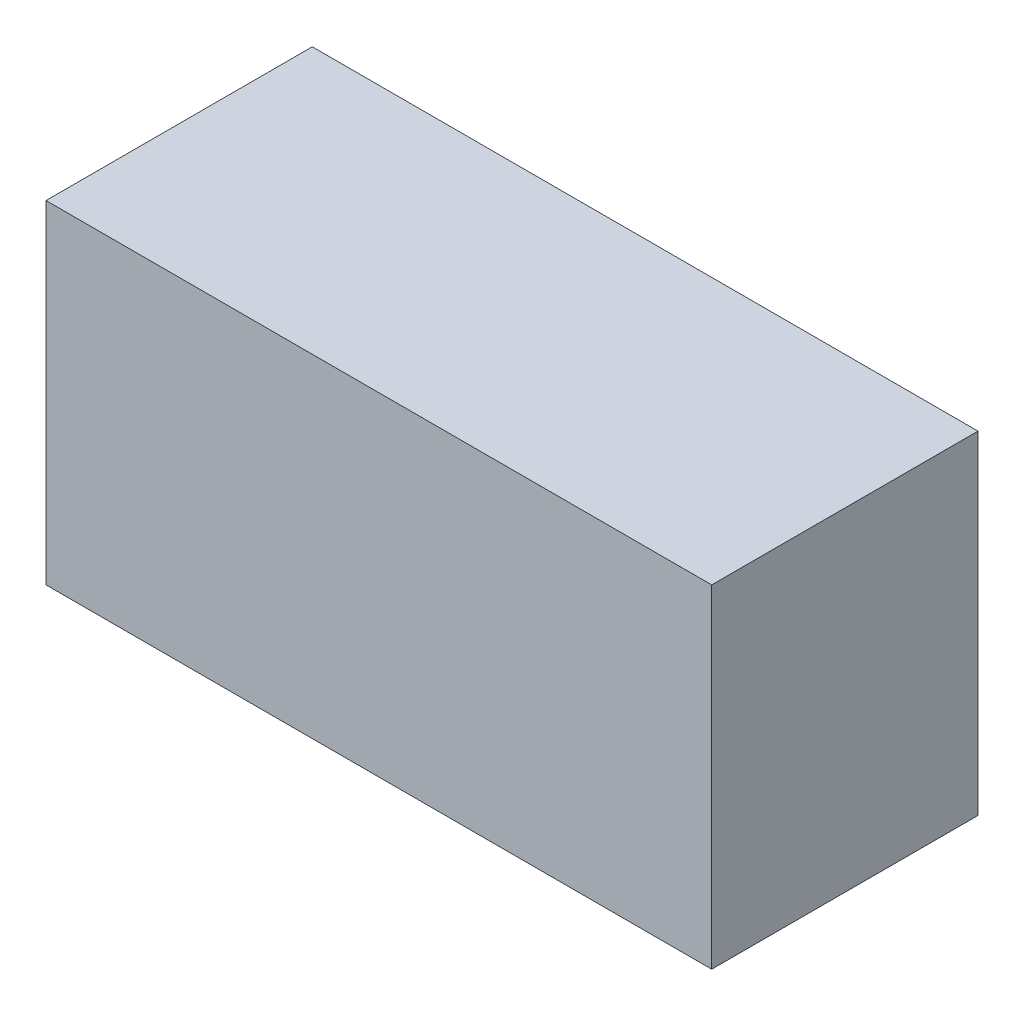
ISO-10303-21;
HEADER;
FILE_DESCRIPTION(('STEP AP214'),'2;1');
FILE_NAME('part.step','',(''),(''),'','','');
FILE_SCHEMA(('AUTOMOTIVE_DESIGN { 1 0 10303 214 1 1 1 1 }'));
ENDSEC;
DATA;
#1=APPLICATION_CONTEXT('core data for automotive mechanical design processes');
#2=APPLICATION_PROTOCOL_DEFINITION('international standard','automotive_design',2000,#1);
#3=PRODUCT_CONTEXT('',#1,'mechanical');
#4=PRODUCT('Part','Part','',(#3));
#5=PRODUCT_RELATED_PRODUCT_CATEGORY('part','',(#4));
#6=PRODUCT_DEFINITION_FORMATION('','',#4);
#7=PRODUCT_DEFINITION_CONTEXT('part definition',#1,'design');
#8=PRODUCT_DEFINITION('design','',#6,#7);
#9=PRODUCT_DEFINITION_SHAPE('','',#8);
#10=(LENGTH_UNIT() NAMED_UNIT(*) SI_UNIT(.MILLI.,.METRE.));
#11=(NAMED_UNIT(*) PLANE_ANGLE_UNIT() SI_UNIT($,.RADIAN.));
#12=(NAMED_UNIT(*) SI_UNIT($,.STERADIAN.) SOLID_ANGLE_UNIT());
#13=UNCERTAINTY_MEASURE_WITH_UNIT(LENGTH_MEASURE(1.E-05),#10,'distance_accuracy_value','');
#14=(GEOMETRIC_REPRESENTATION_CONTEXT(3) GLOBAL_UNCERTAINTY_ASSIGNED_CONTEXT((#13)) GLOBAL_UNIT_ASSIGNED_CONTEXT((#10,
#11,#12)) REPRESENTATION_CONTEXT('',''));
#15=CARTESIAN_POINT('',(0.,0.,0.));
#16=DIRECTION('',(0.,0.,1.));
#17=DIRECTION('',(1.,0.,0.));
#18=AXIS2_PLACEMENT_3D('',#15,#16,#17);
#19=CARTESIAN_POINT('',(50.,0.,-40.));
#20=DIRECTION('',(0.,-1.,0.));
#21=DIRECTION('',(1.,0.,0.));
#22=AXIS2_PLACEMENT_3D('',#19,#20,#21);
#23=PLANE('',#22);
#24=DIRECTION('',(1.,0.,0.));
#25=VECTOR('',#24,1.);
#26=CARTESIAN_POINT('',(50.,0.,0.));
#27=LINE('',#26,#25);
#28=CARTESIAN_POINT('',(-50.,0.,0.));
#29=VERTEX_POINT('',#28);
#30=CARTESIAN_POINT('',(50.,0.,0.));
#31=VERTEX_POINT('',#30);
#32=EDGE_CURVE('E119',#29,#31,#27,.T.);
#33=ORIENTED_EDGE('',*,*,#32,.F.);
#34=DIRECTION('',(0.,0.,1.));
#35=VECTOR('',#34,1.);
#36=CARTESIAN_POINT('',(-50.,0.,-40.));
#37=LINE('',#36,#35);
#38=CARTESIAN_POINT('',(-50.,0.,-40.));
#39=VERTEX_POINT('',#38);
#40=EDGE_CURVE('E11',#39,#29,#37,.T.);
#41=ORIENTED_EDGE('',*,*,#40,.F.);
#42=DIRECTION('',(1.,0.,0.));
#43=VECTOR('',#42,1.);
#44=CARTESIAN_POINT('',(50.,0.,-40.));
#45=LINE('',#44,#43);
#46=CARTESIAN_POINT('',(50.,0.,-40.));
#47=VERTEX_POINT('',#46);
#48=EDGE_CURVE('E109',#39,#47,#45,.T.);
#49=ORIENTED_EDGE('',*,*,#48,.T.);
#50=DIRECTION('',(0.,0.,1.));
#51=VECTOR('',#50,1.);
#52=CARTESIAN_POINT('',(50.,0.,-40.));
#53=LINE('',#52,#51);
#54=EDGE_CURVE('E50',#47,#31,#53,.T.);
#55=ORIENTED_EDGE('',*,*,#54,.T.);
#56=EDGE_LOOP('',(#33,#41,#49,#55));
#57=FACE_BOUND('',#56,.T.);
#58=ADVANCED_FACE('F47',(#57),#23,.T.);
#59=CARTESIAN_POINT('',(-50.,0.,-40.));
#60=DIRECTION('',(-1.,0.,0.));
#61=DIRECTION('',(0.,0.,1.));
#62=AXIS2_PLACEMENT_3D('',#59,#60,#61);
#63=PLANE('',#62);
#64=DIRECTION('',(0.,-1.,0.));
#65=VECTOR('',#64,1.);
#66=CARTESIAN_POINT('',(-50.,0.,0.));
#67=LINE('',#66,#65);
#68=CARTESIAN_POINT('',(-50.,50.,0.));
#69=VERTEX_POINT('',#68);
#70=EDGE_CURVE('E114',#69,#29,#67,.T.);
#71=ORIENTED_EDGE('',*,*,#70,.F.);
#72=DIRECTION('',(0.,0.,1.));
#73=VECTOR('',#72,1.);
#74=CARTESIAN_POINT('',(-50.,50.,-40.));
#75=LINE('',#74,#73);
#76=CARTESIAN_POINT('',(-50.,50.,-40.));
#77=VERTEX_POINT('',#76);
#78=EDGE_CURVE('E57',#77,#69,#75,.T.);
#79=ORIENTED_EDGE('',*,*,#78,.F.);
#80=DIRECTION('',(0.,-1.,0.));
#81=VECTOR('',#80,1.);
#82=CARTESIAN_POINT('',(-50.,0.,-40.));
#83=LINE('',#82,#81);
#84=EDGE_CURVE('E104',#77,#39,#83,.T.);
#85=ORIENTED_EDGE('',*,*,#84,.T.);
#86=ORIENTED_EDGE('',*,*,#40,.T.);
#87=EDGE_LOOP('',(#71,#79,#85,#86));
#88=FACE_BOUND('',#87,.T.);
#89=ADVANCED_FACE('F157',(#88),#63,.T.);
#90=CARTESIAN_POINT('',(-50.,50.,-40.));
#91=DIRECTION('',(0.,1.,0.));
#92=DIRECTION('',(0.,0.,1.));
#93=AXIS2_PLACEMENT_3D('',#90,#91,#92);
#94=PLANE('',#93);
#95=DIRECTION('',(-1.,0.,0.));
#96=VECTOR('',#95,1.);
#97=CARTESIAN_POINT('',(-50.,50.,0.));
#98=LINE('',#97,#96);
#99=CARTESIAN_POINT('',(50.,50.,0.));
#100=VERTEX_POINT('',#99);
#101=EDGE_CURVE('E98',#100,#69,#98,.T.);
#102=ORIENTED_EDGE('',*,*,#101,.F.);
#103=DIRECTION('',(0.,0.,1.));
#104=VECTOR('',#103,1.);
#105=CARTESIAN_POINT('',(50.,50.,-40.));
#106=LINE('',#105,#104);
#107=CARTESIAN_POINT('',(50.,50.,-40.));
#108=VERTEX_POINT('',#107);
#109=EDGE_CURVE('E93',#108,#100,#106,.T.);
#110=ORIENTED_EDGE('',*,*,#109,.F.);
#111=DIRECTION('',(-1.,0.,0.));
#112=VECTOR('',#111,1.);
#113=CARTESIAN_POINT('',(-50.,50.,-40.));
#114=LINE('',#113,#112);
#115=EDGE_CURVE('E96',#108,#77,#114,.T.);
#116=ORIENTED_EDGE('',*,*,#115,.T.);
#117=ORIENTED_EDGE('',*,*,#78,.T.);
#118=EDGE_LOOP('',(#102,#110,#116,#117));
#119=FACE_BOUND('',#118,.T.);
#120=ADVANCED_FACE('F95',(#119),#94,.T.);
#121=CARTESIAN_POINT('',(50.,50.,-40.));
#122=DIRECTION('',(1.,0.,0.));
#123=DIRECTION('',(0.,1.,0.));
#124=AXIS2_PLACEMENT_3D('',#121,#122,#123);
#125=PLANE('',#124);
#126=DIRECTION('',(0.,1.,0.));
#127=VECTOR('',#126,1.);
#128=CARTESIAN_POINT('',(50.,50.,0.));
#129=LINE('',#128,#127);
#130=EDGE_CURVE('E123',#31,#100,#129,.T.);
#131=ORIENTED_EDGE('',*,*,#130,.F.);
#132=ORIENTED_EDGE('',*,*,#54,.F.);
#133=DIRECTION('',(0.,1.,0.));
#134=VECTOR('',#133,1.);
#135=CARTESIAN_POINT('',(50.,50.,-40.));
#136=LINE('',#135,#134);
#137=EDGE_CURVE('E103',#47,#108,#136,.T.);
#138=ORIENTED_EDGE('',*,*,#137,.T.);
#139=ORIENTED_EDGE('',*,*,#109,.T.);
#140=EDGE_LOOP('',(#131,#132,#138,#139));
#141=FACE_BOUND('',#140,.T.);
#142=ADVANCED_FACE('F107',(#141),#125,.T.);
#143=CARTESIAN_POINT('',(0.,0.,-40.));
#144=DIRECTION('',(0.,0.,-1.));
#145=DIRECTION('',(-1.,0.,0.));
#146=AXIS2_PLACEMENT_3D('',#143,#144,#145);
#147=PLANE('',#146);
#148=ORIENTED_EDGE('',*,*,#48,.F.);
#149=ORIENTED_EDGE('',*,*,#84,.F.);
#150=ORIENTED_EDGE('',*,*,#115,.F.);
#151=ORIENTED_EDGE('',*,*,#137,.F.);
#152=EDGE_LOOP('',(#148,#149,#150,#151));
#153=FACE_BOUND('',#152,.T.);
#154=ADVANCED_FACE('F102',(#153),#147,.T.);
#155=CARTESIAN_POINT('',(0.,0.,0.));
#156=DIRECTION('',(0.,0.,-1.));
#157=DIRECTION('',(-1.,0.,0.));
#158=AXIS2_PLACEMENT_3D('',#155,#156,#157);
#159=PLANE('',#158);
#160=ORIENTED_EDGE('',*,*,#32,.T.);
#161=ORIENTED_EDGE('',*,*,#130,.T.);
#162=ORIENTED_EDGE('',*,*,#101,.T.);
#163=ORIENTED_EDGE('',*,*,#70,.T.);
#164=EDGE_LOOP('',(#160,#161,#162,#163));
#165=FACE_BOUND('',#164,.T.);
#166=ADVANCED_FACE('F156',(#165),#159,.F.);
#167=CLOSED_SHELL('',(#58,#89,#120,#142,#154,#166));
#168=MANIFOLD_SOLID_BREP('B2',#167);
#169=ADVANCED_BREP_SHAPE_REPRESENTATION('',(#18,#168),#14);
#170=SHAPE_DEFINITION_REPRESENTATION(#9,#169);
ENDSEC;
END-ISO-10303-21;
